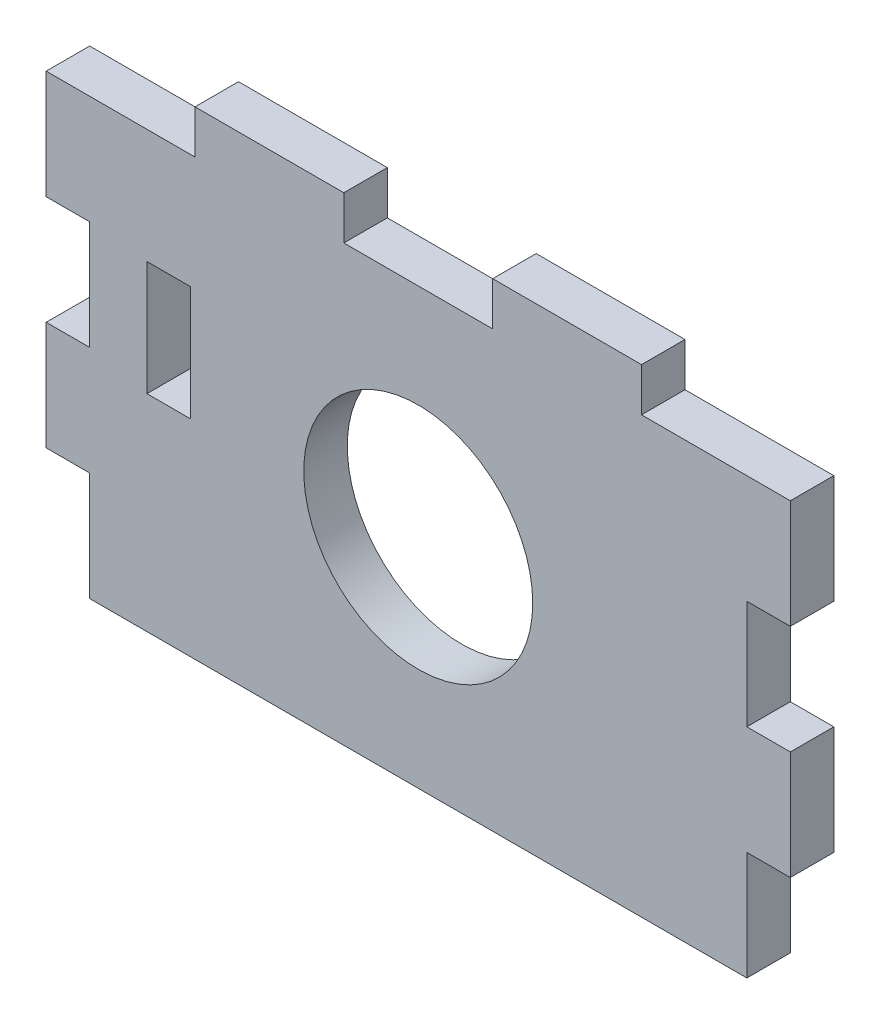
ISO-10303-21;
HEADER;
FILE_DESCRIPTION(('STEP AP214'),'2;1');
FILE_NAME('part.step','',(''),(''),'','','');
FILE_SCHEMA(('AUTOMOTIVE_DESIGN { 1 0 10303 214 1 1 1 1 }'));
ENDSEC;
DATA;
#1=APPLICATION_CONTEXT('core data for automotive mechanical design processes');
#2=APPLICATION_PROTOCOL_DEFINITION('international standard','automotive_design',2000,#1);
#3=PRODUCT_CONTEXT('',#1,'mechanical');
#4=PRODUCT('Part','Part','',(#3));
#5=PRODUCT_RELATED_PRODUCT_CATEGORY('part','',(#4));
#6=PRODUCT_DEFINITION_FORMATION('','',#4);
#7=PRODUCT_DEFINITION_CONTEXT('part definition',#1,'design');
#8=PRODUCT_DEFINITION('design','',#6,#7);
#9=PRODUCT_DEFINITION_SHAPE('','',#8);
#10=(LENGTH_UNIT() NAMED_UNIT(*) SI_UNIT(.MILLI.,.METRE.));
#11=(NAMED_UNIT(*) PLANE_ANGLE_UNIT() SI_UNIT($,.RADIAN.));
#12=(NAMED_UNIT(*) SI_UNIT($,.STERADIAN.) SOLID_ANGLE_UNIT());
#13=UNCERTAINTY_MEASURE_WITH_UNIT(LENGTH_MEASURE(1.E-05),#10,'distance_accuracy_value','');
#14=(GEOMETRIC_REPRESENTATION_CONTEXT(3) GLOBAL_UNCERTAINTY_ASSIGNED_CONTEXT((#13)) GLOBAL_UNIT_ASSIGNED_CONTEXT((#10,
#11,#12)) REPRESENTATION_CONTEXT('',''));
#15=CARTESIAN_POINT('',(0.,0.,0.));
#16=DIRECTION('',(0.,0.,1.));
#17=DIRECTION('',(1.,0.,0.));
#18=AXIS2_PLACEMENT_3D('',#15,#16,#17);
#19=CARTESIAN_POINT('',(-5.53524932452526,14.1108572179902,4.826));
#20=DIRECTION('',(-1.,0.,0.));
#21=DIRECTION('',(0.,0.,1.));
#22=AXIS2_PLACEMENT_3D('',#19,#20,#21);
#23=PLANE('',#22);
#24=DIRECTION('',(0.,1.,0.));
#25=VECTOR('',#24,1.);
#26=CARTESIAN_POINT('',(-5.53524932452526,14.1108572179902,4.826));
#27=LINE('',#26,#25);
#28=CARTESIAN_POINT('',(-5.53524932452527,-2.78014278200983,4.826));
#29=VERTEX_POINT('',#28);
#30=CARTESIAN_POINT('',(-5.53524932452526,9.28485721799016,4.826));
#31=VERTEX_POINT('',#30);
#32=EDGE_CURVE('E423',#29,#31,#27,.T.);
#33=ORIENTED_EDGE('',*,*,#32,.F.);
#34=DIRECTION('',(0.,0.,1.));
#35=VECTOR('',#34,1.);
#36=CARTESIAN_POINT('',(-5.53524932452527,-2.78014278200983,0.));
#37=LINE('',#36,#35);
#38=CARTESIAN_POINT('',(-5.53524932452527,-2.78014278200983,0.));
#39=VERTEX_POINT('',#38);
#40=EDGE_CURVE('E279',#39,#29,#37,.T.);
#41=ORIENTED_EDGE('',*,*,#40,.F.);
#42=DIRECTION('',(0.,1.,0.));
#43=VECTOR('',#42,1.);
#44=CARTESIAN_POINT('',(-5.53524932452526,14.1108572179902,0.));
#45=LINE('',#44,#43);
#46=CARTESIAN_POINT('',(-5.53524932452526,9.28485721799016,0.));
#47=VERTEX_POINT('',#46);
#48=EDGE_CURVE('E432',#39,#47,#45,.T.);
#49=ORIENTED_EDGE('',*,*,#48,.T.);
#50=DIRECTION('',(0.,0.,1.));
#51=VECTOR('',#50,1.);
#52=CARTESIAN_POINT('',(-5.53524932452526,9.28485721799016,0.));
#53=LINE('',#52,#51);
#54=EDGE_CURVE('E366',#47,#31,#53,.T.);
#55=ORIENTED_EDGE('',*,*,#54,.T.);
#56=EDGE_LOOP('',(#33,#41,#49,#55));
#57=FACE_BOUND('',#56,.T.);
#58=ADVANCED_FACE('F33',(#57),#23,.F.);
#59=CARTESIAN_POINT('',(-88.0852493245253,14.1108572179902,4.826));
#60=DIRECTION('',(1.,0.,0.));
#61=DIRECTION('',(0.,0.,-1.));
#62=AXIS2_PLACEMENT_3D('',#59,#60,#61);
#63=PLANE('',#62);
#64=DIRECTION('',(0.,-1.,0.));
#65=VECTOR('',#64,1.);
#66=CARTESIAN_POINT('',(-88.0852493245253,14.1108572179902,0.));
#67=LINE('',#66,#65);
#68=CARTESIAN_POINT('',(-88.0852493245253,9.28485721799016,0.));
#69=VERTEX_POINT('',#68);
#70=CARTESIAN_POINT('',(-88.0852493245253,-2.78014278200984,0.));
#71=VERTEX_POINT('',#70);
#72=EDGE_CURVE('E427',#69,#71,#67,.T.);
#73=ORIENTED_EDGE('',*,*,#72,.T.);
#74=DIRECTION('',(0.,0.,1.));
#75=VECTOR('',#74,1.);
#76=CARTESIAN_POINT('',(-88.0852493245253,-2.78014278200984,0.));
#77=LINE('',#76,#75);
#78=CARTESIAN_POINT('',(-88.0852493245253,-2.78014278200984,4.826));
#79=VERTEX_POINT('',#78);
#80=EDGE_CURVE('E323',#71,#79,#77,.T.);
#81=ORIENTED_EDGE('',*,*,#80,.T.);
#82=DIRECTION('',(0.,-1.,0.));
#83=VECTOR('',#82,1.);
#84=CARTESIAN_POINT('',(-88.0852493245253,14.1108572179902,4.826));
#85=LINE('',#84,#83);
#86=CARTESIAN_POINT('',(-88.0852493245253,9.28485721799016,4.826));
#87=VERTEX_POINT('',#86);
#88=EDGE_CURVE('E416',#87,#79,#85,.T.);
#89=ORIENTED_EDGE('',*,*,#88,.F.);
#90=DIRECTION('',(0.,0.,1.));
#91=VECTOR('',#90,1.);
#92=CARTESIAN_POINT('',(-88.0852493245253,9.28485721799016,0.));
#93=LINE('',#92,#91);
#94=EDGE_CURVE('E404',#69,#87,#93,.T.);
#95=ORIENTED_EDGE('',*,*,#94,.F.);
#96=EDGE_LOOP('',(#73,#81,#89,#95));
#97=FACE_BOUND('',#96,.T.);
#98=ADVANCED_FACE('F488',(#97),#63,.F.);
#99=CARTESIAN_POINT('',(-88.0852493245253,14.1108572179902,4.826));
#100=DIRECTION('',(0.,-1.,0.));
#101=DIRECTION('',(0.,0.,-1.));
#102=AXIS2_PLACEMENT_3D('',#99,#100,#101);
#103=PLANE('',#102);
#104=DIRECTION('',(-1.,0.,0.));
#105=VECTOR('',#104,1.);
#106=CARTESIAN_POINT('',(-88.0852493245253,14.1108572179902,4.826));
#107=LINE('',#106,#105);
#108=CARTESIAN_POINT('',(-55.0652493245253,14.1108572179902,4.826));
#109=VERTEX_POINT('',#108);
#110=CARTESIAN_POINT('',(-71.5752493245253,14.1108572179902,4.826));
#111=VERTEX_POINT('',#110);
#112=EDGE_CURVE('E42',#109,#111,#107,.T.);
#113=ORIENTED_EDGE('',*,*,#112,.F.);
#114=DIRECTION('',(0.,0.,1.));
#115=VECTOR('',#114,1.);
#116=CARTESIAN_POINT('',(-55.0652493245253,14.1108572179902,0.));
#117=LINE('',#116,#115);
#118=CARTESIAN_POINT('',(-55.0652493245253,14.1108572179902,0.));
#119=VERTEX_POINT('',#118);
#120=EDGE_CURVE('E388',#119,#109,#117,.T.);
#121=ORIENTED_EDGE('',*,*,#120,.F.);
#122=DIRECTION('',(-1.,0.,0.));
#123=VECTOR('',#122,1.);
#124=CARTESIAN_POINT('',(-88.0852493245253,14.1108572179902,0.));
#125=LINE('',#124,#123);
#126=CARTESIAN_POINT('',(-71.5752493245253,14.1108572179902,0.));
#127=VERTEX_POINT('',#126);
#128=EDGE_CURVE('E435',#119,#127,#125,.T.);
#129=ORIENTED_EDGE('',*,*,#128,.T.);
#130=DIRECTION('',(0.,0.,1.));
#131=VECTOR('',#130,1.);
#132=CARTESIAN_POINT('',(-71.5752493245253,14.1108572179902,0.));
#133=LINE('',#132,#131);
#134=EDGE_CURVE('E409',#127,#111,#133,.T.);
#135=ORIENTED_EDGE('',*,*,#134,.T.);
#136=EDGE_LOOP('',(#113,#121,#129,#135));
#137=FACE_BOUND('',#136,.T.);
#138=ADVANCED_FACE('F475',(#137),#103,.F.);
#139=CARTESIAN_POINT('',(-88.0852493245253,-14.8451427820098,4.826));
#140=VERTEX_POINT('',#139);
#141=CARTESIAN_POINT('',(-88.0852493245253,-26.9101427820098,4.826));
#142=VERTEX_POINT('',#141);
#143=EDGE_CURVE('E420',#140,#142,#85,.T.);
#144=ORIENTED_EDGE('',*,*,#143,.F.);
#145=DIRECTION('',(0.,0.,1.));
#146=VECTOR('',#145,1.);
#147=CARTESIAN_POINT('',(-88.0852493245253,-14.8451427820098,0.));
#148=LINE('',#147,#146);
#149=CARTESIAN_POINT('',(-88.0852493245253,-14.8451427820098,0.));
#150=VERTEX_POINT('',#149);
#151=EDGE_CURVE('E316',#150,#140,#148,.T.);
#152=ORIENTED_EDGE('',*,*,#151,.F.);
#153=CARTESIAN_POINT('',(-88.0852493245253,-26.9101427820098,0.));
#154=VERTEX_POINT('',#153);
#155=EDGE_CURVE('E412',#150,#154,#67,.T.);
#156=ORIENTED_EDGE('',*,*,#155,.T.);
#157=DIRECTION('',(0.,0.,1.));
#158=VECTOR('',#157,1.);
#159=CARTESIAN_POINT('',(-88.0852493245253,-26.9101427820098,0.));
#160=LINE('',#159,#158);
#161=EDGE_CURVE('E344',#154,#142,#160,.T.);
#162=ORIENTED_EDGE('',*,*,#161,.T.);
#163=EDGE_LOOP('',(#144,#152,#156,#162));
#164=FACE_BOUND('',#163,.T.);
#165=ADVANCED_FACE('F35',(#164),#63,.F.);
#166=CARTESIAN_POINT('',(-88.0852493245253,-38.9751427820098,4.826));
#167=DIRECTION('',(0.,1.,0.));
#168=DIRECTION('',(0.,0.,1.));
#169=AXIS2_PLACEMENT_3D('',#166,#167,#168);
#170=PLANE('',#169);
#171=DIRECTION('',(1.,0.,0.));
#172=VECTOR('',#171,1.);
#173=CARTESIAN_POINT('',(-88.0852493245253,-38.9751427820098,0.));
#174=LINE('',#173,#172);
#175=CARTESIAN_POINT('',(-83.2592493245252,-38.9751427820098,0.));
#176=VERTEX_POINT('',#175);
#177=CARTESIAN_POINT('',(-10.3612493245253,-38.9751427820098,0.));
#178=VERTEX_POINT('',#177);
#179=EDGE_CURVE('E430',#176,#178,#174,.T.);
#180=ORIENTED_EDGE('',*,*,#179,.T.);
#181=DIRECTION('',(0.,0.,1.));
#182=VECTOR('',#181,1.);
#183=CARTESIAN_POINT('',(-10.3612493245253,-38.9751427820098,0.));
#184=LINE('',#183,#182);
#185=CARTESIAN_POINT('',(-10.3612493245253,-38.9751427820098,4.826));
#186=VERTEX_POINT('',#185);
#187=EDGE_CURVE('E299',#178,#186,#184,.T.);
#188=ORIENTED_EDGE('',*,*,#187,.T.);
#189=DIRECTION('',(1.,0.,0.));
#190=VECTOR('',#189,1.);
#191=CARTESIAN_POINT('',(-88.0852493245253,-38.9751427820098,4.826));
#192=LINE('',#191,#190);
#193=CARTESIAN_POINT('',(-83.2592493245252,-38.9751427820098,4.826));
#194=VERTEX_POINT('',#193);
#195=EDGE_CURVE('E419',#194,#186,#192,.T.);
#196=ORIENTED_EDGE('',*,*,#195,.F.);
#197=DIRECTION('',(0.,0.,1.));
#198=VECTOR('',#197,1.);
#199=CARTESIAN_POINT('',(-83.2592493245252,-38.9751427820098,0.));
#200=LINE('',#199,#198);
#201=EDGE_CURVE('E339',#176,#194,#200,.T.);
#202=ORIENTED_EDGE('',*,*,#201,.F.);
#203=EDGE_LOOP('',(#180,#188,#196,#202));
#204=FACE_BOUND('',#203,.T.);
#205=ADVANCED_FACE('F516',(#204),#170,.F.);
#206=CARTESIAN_POINT('',(-5.53524932452526,-26.9101427820098,0.));
#207=VERTEX_POINT('',#206);
#208=CARTESIAN_POINT('',(-5.53524932452527,-14.8451427820098,0.));
#209=VERTEX_POINT('',#208);
#210=EDGE_CURVE('E433',#207,#209,#45,.T.);
#211=ORIENTED_EDGE('',*,*,#210,.T.);
#212=DIRECTION('',(0.,0.,1.));
#213=VECTOR('',#212,1.);
#214=CARTESIAN_POINT('',(-5.53524932452527,-14.8451427820098,0.));
#215=LINE('',#214,#213);
#216=CARTESIAN_POINT('',(-5.53524932452527,-14.8451427820098,4.826));
#217=VERTEX_POINT('',#216);
#218=EDGE_CURVE('E282',#209,#217,#215,.T.);
#219=ORIENTED_EDGE('',*,*,#218,.T.);
#220=CARTESIAN_POINT('',(-5.53524932452526,-26.9101427820098,4.826));
#221=VERTEX_POINT('',#220);
#222=EDGE_CURVE('E424',#221,#217,#27,.T.);
#223=ORIENTED_EDGE('',*,*,#222,.F.);
#224=DIRECTION('',(0.,0.,1.));
#225=VECTOR('',#224,1.);
#226=CARTESIAN_POINT('',(-5.53524932452526,-26.9101427820098,0.));
#227=LINE('',#226,#225);
#228=EDGE_CURVE('E295',#207,#221,#227,.T.);
#229=ORIENTED_EDGE('',*,*,#228,.F.);
#230=EDGE_LOOP('',(#211,#219,#223,#229));
#231=FACE_BOUND('',#230,.T.);
#232=ADVANCED_FACE('F525',(#231),#23,.F.);
#233=CARTESIAN_POINT('',(-22.0452493245253,14.1108572179902,4.826));
#234=VERTEX_POINT('',#233);
#235=CARTESIAN_POINT('',(-38.5552493245253,14.1108572179902,4.826));
#236=VERTEX_POINT('',#235);
#237=EDGE_CURVE('E11',#234,#236,#107,.T.);
#238=ORIENTED_EDGE('',*,*,#237,.F.);
#239=DIRECTION('',(0.,0.,1.));
#240=VECTOR('',#239,1.);
#241=CARTESIAN_POINT('',(-22.0452493245253,14.1108572179902,0.));
#242=LINE('',#241,#240);
#243=CARTESIAN_POINT('',(-22.0452493245253,14.1108572179902,0.));
#244=VERTEX_POINT('',#243);
#245=EDGE_CURVE('E363',#244,#234,#242,.T.);
#246=ORIENTED_EDGE('',*,*,#245,.F.);
#247=CARTESIAN_POINT('',(-38.5552493245253,14.1108572179902,0.));
#248=VERTEX_POINT('',#247);
#249=EDGE_CURVE('E37',#244,#248,#125,.T.);
#250=ORIENTED_EDGE('',*,*,#249,.T.);
#251=DIRECTION('',(0.,0.,1.));
#252=VECTOR('',#251,1.);
#253=CARTESIAN_POINT('',(-38.5552493245253,14.1108572179902,0.));
#254=LINE('',#253,#252);
#255=EDGE_CURVE('E391',#248,#236,#254,.T.);
#256=ORIENTED_EDGE('',*,*,#255,.T.);
#257=EDGE_LOOP('',(#238,#246,#250,#256));
#258=FACE_BOUND('',#257,.T.);
#259=ADVANCED_FACE('F456',(#258),#103,.F.);
#260=CARTESIAN_POINT('',(0.,0.,4.826));
#261=DIRECTION('',(0.,0.,1.));
#262=DIRECTION('',(1.,0.,0.));
#263=AXIS2_PLACEMENT_3D('',#260,#261,#262);
#264=PLANE('',#263);
#265=DIRECTION('',(0.,1.,0.));
#266=VECTOR('',#265,1.);
#267=CARTESIAN_POINT('',(-72.0832493245252,-16.1151427820099,4.826));
#268=LINE('',#267,#266);
#269=CARTESIAN_POINT('',(-72.0832493245252,-16.1151427820099,4.826));
#270=VERTEX_POINT('',#269);
#271=CARTESIAN_POINT('',(-72.0832493245252,-3.4151427820099,4.826));
#272=VERTEX_POINT('',#271);
#273=EDGE_CURVE('E50',#270,#272,#268,.T.);
#274=ORIENTED_EDGE('',*,*,#273,.F.);
#275=DIRECTION('',(1.,0.,0.));
#276=VECTOR('',#275,1.);
#277=CARTESIAN_POINT('',(-72.0832493245252,-16.1151427820099,4.826));
#278=LINE('',#277,#276);
#279=CARTESIAN_POINT('',(-76.9092493245252,-16.1151427820099,4.826));
#280=VERTEX_POINT('',#279);
#281=EDGE_CURVE('E237',#280,#270,#278,.T.);
#282=ORIENTED_EDGE('',*,*,#281,.F.);
#283=DIRECTION('',(0.,-1.,0.));
#284=VECTOR('',#283,1.);
#285=CARTESIAN_POINT('',(-76.9092493245252,-16.1151427820099,4.826));
#286=LINE('',#285,#284);
#287=CARTESIAN_POINT('',(-76.9092493245252,-3.4151427820099,4.826));
#288=VERTEX_POINT('',#287);
#289=EDGE_CURVE('E240',#288,#280,#286,.T.);
#290=ORIENTED_EDGE('',*,*,#289,.F.);
#291=DIRECTION('',(-1.,0.,0.));
#292=VECTOR('',#291,1.);
#293=CARTESIAN_POINT('',(-72.0832493245252,-3.4151427820099,4.826));
#294=LINE('',#293,#292);
#295=EDGE_CURVE('E246',#272,#288,#294,.T.);
#296=ORIENTED_EDGE('',*,*,#295,.F.);
#297=EDGE_LOOP('',(#274,#282,#290,#296));
#298=FACE_BOUND('',#297,.T.);
#299=CARTESIAN_POINT('',(-46.8102493245253,-14.8451427820098,4.826));
#300=DIRECTION('',(0.,0.,1.));
#301=DIRECTION('',(1.,0.,0.));
#302=AXIS2_PLACEMENT_3D('',#299,#300,#301);
#303=CIRCLE('',#302,12.7);
#304=CARTESIAN_POINT('',(-34.1102493245253,-14.8451427820098,4.826));
#305=VERTEX_POINT('',#304);
#306=EDGE_CURVE('E252',#305,#305,#303,.T.);
#307=ORIENTED_EDGE('',*,*,#306,.F.);
#308=EDGE_LOOP('',(#307));
#309=FACE_BOUND('',#308,.T.);
#310=DIRECTION('',(-1.,0.,0.));
#311=VECTOR('',#310,1.);
#312=CARTESIAN_POINT('',(-5.53524932452527,-2.78014278200983,4.826));
#313=LINE('',#312,#311);
#314=CARTESIAN_POINT('',(-10.3612493245253,-2.78014278200983,4.826));
#315=VERTEX_POINT('',#314);
#316=EDGE_CURVE('E259',#29,#315,#313,.T.);
#317=ORIENTED_EDGE('',*,*,#316,.F.);
#318=ORIENTED_EDGE('',*,*,#32,.T.);
#319=DIRECTION('',(1.,0.,0.));
#320=VECTOR('',#319,1.);
#321=CARTESIAN_POINT('',(-22.0452493245253,9.28485721799016,4.826));
#322=LINE('',#321,#320);
#323=CARTESIAN_POINT('',(-22.0452493245253,9.28485721799016,4.826));
#324=VERTEX_POINT('',#323);
#325=EDGE_CURVE('E355',#324,#31,#322,.T.);
#326=ORIENTED_EDGE('',*,*,#325,.F.);
#327=DIRECTION('',(0.,-1.,0.));
#328=VECTOR('',#327,1.);
#329=CARTESIAN_POINT('',(-22.0452493245253,14.1108572179902,4.826));
#330=LINE('',#329,#328);
#331=EDGE_CURVE('E347',#234,#324,#330,.T.);
#332=ORIENTED_EDGE('',*,*,#331,.F.);
#333=ORIENTED_EDGE('',*,*,#237,.T.);
#334=DIRECTION('',(0.,1.,0.));
#335=VECTOR('',#334,1.);
#336=CARTESIAN_POINT('',(-38.5552493245253,14.1108572179902,4.826));
#337=LINE('',#336,#335);
#338=CARTESIAN_POINT('',(-38.5552493245253,9.28485721799016,4.826));
#339=VERTEX_POINT('',#338);
#340=EDGE_CURVE('E374',#339,#236,#337,.T.);
#341=ORIENTED_EDGE('',*,*,#340,.F.);
#342=DIRECTION('',(1.,0.,0.));
#343=VECTOR('',#342,1.);
#344=CARTESIAN_POINT('',(-55.0652493245253,9.28485721799016,4.826));
#345=LINE('',#344,#343);
#346=CARTESIAN_POINT('',(-55.0652493245253,9.28485721799016,4.826));
#347=VERTEX_POINT('',#346);
#348=EDGE_CURVE('E383',#347,#339,#345,.T.);
#349=ORIENTED_EDGE('',*,*,#348,.F.);
#350=DIRECTION('',(0.,-1.,0.));
#351=VECTOR('',#350,1.);
#352=CARTESIAN_POINT('',(-55.0652493245253,14.1108572179902,4.826));
#353=LINE('',#352,#351);
#354=EDGE_CURVE('E365',#109,#347,#353,.T.);
#355=ORIENTED_EDGE('',*,*,#354,.F.);
#356=ORIENTED_EDGE('',*,*,#112,.T.);
#357=DIRECTION('',(0.,1.,0.));
#358=VECTOR('',#357,1.);
#359=CARTESIAN_POINT('',(-71.5752493245253,14.1108572179902,4.826));
#360=LINE('',#359,#358);
#361=CARTESIAN_POINT('',(-71.5752493245253,9.28485721799016,4.826));
#362=VERTEX_POINT('',#361);
#363=EDGE_CURVE('E401',#362,#111,#360,.T.);
#364=ORIENTED_EDGE('',*,*,#363,.F.);
#365=DIRECTION('',(1.,0.,0.));
#366=VECTOR('',#365,1.);
#367=CARTESIAN_POINT('',(-88.0852493245253,9.28485721799016,4.826));
#368=LINE('',#367,#366);
#369=EDGE_CURVE('E390',#87,#362,#368,.T.);
#370=ORIENTED_EDGE('',*,*,#369,.F.);
#371=ORIENTED_EDGE('',*,*,#88,.T.);
#372=DIRECTION('',(-1.,0.,0.));
#373=VECTOR('',#372,1.);
#374=CARTESIAN_POINT('',(-88.0852493245253,-2.78014278200984,4.826));
#375=LINE('',#374,#373);
#376=CARTESIAN_POINT('',(-83.2592493245253,-2.78014278200984,4.826));
#377=VERTEX_POINT('',#376);
#378=EDGE_CURVE('E310',#377,#79,#375,.T.);
#379=ORIENTED_EDGE('',*,*,#378,.F.);
#380=DIRECTION('',(0.,1.,0.));
#381=VECTOR('',#380,1.);
#382=CARTESIAN_POINT('',(-83.2592493245253,-2.78014278200984,4.826));
#383=LINE('',#382,#381);
#384=CARTESIAN_POINT('',(-83.2592493245253,-14.8451427820098,4.826));
#385=VERTEX_POINT('',#384);
#386=EDGE_CURVE('E319',#385,#377,#383,.T.);
#387=ORIENTED_EDGE('',*,*,#386,.F.);
#388=DIRECTION('',(1.,0.,0.));
#389=VECTOR('',#388,1.);
#390=CARTESIAN_POINT('',(-88.0852493245253,-14.8451427820098,4.826));
#391=LINE('',#390,#389);
#392=EDGE_CURVE('E302',#140,#385,#391,.T.);
#393=ORIENTED_EDGE('',*,*,#392,.F.);
#394=ORIENTED_EDGE('',*,*,#143,.T.);
#395=DIRECTION('',(-1.,0.,0.));
#396=VECTOR('',#395,1.);
#397=CARTESIAN_POINT('',(-88.0852493245253,-26.9101427820098,4.826));
#398=LINE('',#397,#396);
#399=CARTESIAN_POINT('',(-83.2592493245253,-26.9101427820098,4.826));
#400=VERTEX_POINT('',#399);
#401=EDGE_CURVE('E336',#400,#142,#398,.T.);
#402=ORIENTED_EDGE('',*,*,#401,.F.);
#403=DIRECTION('',(0.,1.,0.));
#404=VECTOR('',#403,1.);
#405=CARTESIAN_POINT('',(-83.2592493245252,-38.9751427820098,4.826));
#406=LINE('',#405,#404);
#407=EDGE_CURVE('E326',#194,#400,#406,.T.);
#408=ORIENTED_EDGE('',*,*,#407,.F.);
#409=ORIENTED_EDGE('',*,*,#195,.T.);
#410=DIRECTION('',(0.,-1.,0.));
#411=VECTOR('',#410,1.);
#412=CARTESIAN_POINT('',(-10.3612493245253,-38.9751427820098,4.826));
#413=LINE('',#412,#411);
#414=CARTESIAN_POINT('',(-10.3612493245253,-26.9101427820098,4.826));
#415=VERTEX_POINT('',#414);
#416=EDGE_CURVE('E292',#415,#186,#413,.T.);
#417=ORIENTED_EDGE('',*,*,#416,.F.);
#418=DIRECTION('',(-1.,0.,0.));
#419=VECTOR('',#418,1.);
#420=CARTESIAN_POINT('',(-5.53524932452526,-26.9101427820098,4.826));
#421=LINE('',#420,#419);
#422=EDGE_CURVE('E281',#221,#415,#421,.T.);
#423=ORIENTED_EDGE('',*,*,#422,.F.);
#424=ORIENTED_EDGE('',*,*,#222,.T.);
#425=DIRECTION('',(1.,0.,0.));
#426=VECTOR('',#425,1.);
#427=CARTESIAN_POINT('',(-5.53524932452527,-14.8451427820098,4.826));
#428=LINE('',#427,#426);
#429=CARTESIAN_POINT('',(-10.3612493245253,-14.8451427820098,4.826));
#430=VERTEX_POINT('',#429);
#431=EDGE_CURVE('E266',#430,#217,#428,.T.);
#432=ORIENTED_EDGE('',*,*,#431,.F.);
#433=DIRECTION('',(0.,-1.,0.));
#434=VECTOR('',#433,1.);
#435=CARTESIAN_POINT('',(-10.3612493245253,-2.78014278200983,4.826));
#436=LINE('',#435,#434);
#437=EDGE_CURVE('E275',#315,#430,#436,.T.);
#438=ORIENTED_EDGE('',*,*,#437,.F.);
#439=EDGE_LOOP('',(#317,#318,#326,#332,#333,#341,#349,#355,#356,#364,#370,#371,#379,#387,#393,
#394,#402,#408,#409,#417,#423,#424,#432,#438));
#440=FACE_BOUND('',#439,.T.);
#441=ADVANCED_FACE('F461',(#298,#309,#440),#264,.T.);
#442=CARTESIAN_POINT('',(0.,0.,0.));
#443=DIRECTION('',(0.,0.,1.));
#444=DIRECTION('',(1.,0.,0.));
#445=AXIS2_PLACEMENT_3D('',#442,#443,#444);
#446=PLANE('',#445);
#447=DIRECTION('',(1.,0.,0.));
#448=VECTOR('',#447,1.);
#449=CARTESIAN_POINT('',(-72.0832493245252,-16.1151427820099,0.));
#450=LINE('',#449,#448);
#451=CARTESIAN_POINT('',(-76.9092493245252,-16.1151427820099,0.));
#452=VERTEX_POINT('',#451);
#453=CARTESIAN_POINT('',(-72.0832493245252,-16.1151427820099,0.));
#454=VERTEX_POINT('',#453);
#455=EDGE_CURVE('E227',#452,#454,#450,.T.);
#456=ORIENTED_EDGE('',*,*,#455,.T.);
#457=DIRECTION('',(0.,1.,0.));
#458=VECTOR('',#457,1.);
#459=CARTESIAN_POINT('',(-72.0832493245252,-16.1151427820099,0.));
#460=LINE('',#459,#458);
#461=CARTESIAN_POINT('',(-72.0832493245252,-3.4151427820099,0.));
#462=VERTEX_POINT('',#461);
#463=EDGE_CURVE('E221',#454,#462,#460,.T.);
#464=ORIENTED_EDGE('',*,*,#463,.T.);
#465=DIRECTION('',(-1.,0.,0.));
#466=VECTOR('',#465,1.);
#467=CARTESIAN_POINT('',(-72.0832493245252,-3.4151427820099,0.));
#468=LINE('',#467,#466);
#469=CARTESIAN_POINT('',(-76.9092493245252,-3.4151427820099,0.));
#470=VERTEX_POINT('',#469);
#471=EDGE_CURVE('E230',#462,#470,#468,.T.);
#472=ORIENTED_EDGE('',*,*,#471,.T.);
#473=DIRECTION('',(0.,-1.,0.));
#474=VECTOR('',#473,1.);
#475=CARTESIAN_POINT('',(-76.9092493245252,-16.1151427820099,0.));
#476=LINE('',#475,#474);
#477=EDGE_CURVE('E58',#470,#452,#476,.T.);
#478=ORIENTED_EDGE('',*,*,#477,.T.);
#479=EDGE_LOOP('',(#456,#464,#472,#478));
#480=FACE_BOUND('',#479,.T.);
#481=CARTESIAN_POINT('',(-46.8102493245253,-14.8451427820098,0.));
#482=DIRECTION('',(0.,0.,1.));
#483=DIRECTION('',(1.,0.,0.));
#484=AXIS2_PLACEMENT_3D('',#481,#482,#483);
#485=CIRCLE('',#484,12.7);
#486=CARTESIAN_POINT('',(-34.1102493245253,-14.8451427820098,0.));
#487=VERTEX_POINT('',#486);
#488=EDGE_CURVE('E256',#487,#487,#485,.T.);
#489=ORIENTED_EDGE('',*,*,#488,.T.);
#490=EDGE_LOOP('',(#489));
#491=FACE_BOUND('',#490,.T.);
#492=ORIENTED_EDGE('',*,*,#48,.F.);
#493=DIRECTION('',(-1.,0.,0.));
#494=VECTOR('',#493,1.);
#495=CARTESIAN_POINT('',(-5.53524932452527,-2.78014278200983,0.));
#496=LINE('',#495,#494);
#497=CARTESIAN_POINT('',(-10.3612493245253,-2.78014278200983,0.));
#498=VERTEX_POINT('',#497);
#499=EDGE_CURVE('E262',#39,#498,#496,.T.);
#500=ORIENTED_EDGE('',*,*,#499,.T.);
#501=DIRECTION('',(0.,-1.,0.));
#502=VECTOR('',#501,1.);
#503=CARTESIAN_POINT('',(-10.3612493245253,-2.78014278200983,0.));
#504=LINE('',#503,#502);
#505=CARTESIAN_POINT('',(-10.3612493245253,-14.8451427820098,0.));
#506=VERTEX_POINT('',#505);
#507=EDGE_CURVE('E265',#498,#506,#504,.T.);
#508=ORIENTED_EDGE('',*,*,#507,.T.);
#509=DIRECTION('',(1.,0.,0.));
#510=VECTOR('',#509,1.);
#511=CARTESIAN_POINT('',(-5.53524932452527,-14.8451427820098,0.));
#512=LINE('',#511,#510);
#513=EDGE_CURVE('E269',#506,#209,#512,.T.);
#514=ORIENTED_EDGE('',*,*,#513,.T.);
#515=ORIENTED_EDGE('',*,*,#210,.F.);
#516=DIRECTION('',(-1.,0.,0.));
#517=VECTOR('',#516,1.);
#518=CARTESIAN_POINT('',(-5.53524932452526,-26.9101427820098,0.));
#519=LINE('',#518,#517);
#520=CARTESIAN_POINT('',(-10.3612493245253,-26.9101427820098,0.));
#521=VERTEX_POINT('',#520);
#522=EDGE_CURVE('E288',#207,#521,#519,.T.);
#523=ORIENTED_EDGE('',*,*,#522,.T.);
#524=DIRECTION('',(0.,-1.,0.));
#525=VECTOR('',#524,1.);
#526=CARTESIAN_POINT('',(-10.3612493245253,-38.9751427820098,0.));
#527=LINE('',#526,#525);
#528=EDGE_CURVE('E291',#521,#178,#527,.T.);
#529=ORIENTED_EDGE('',*,*,#528,.T.);
#530=ORIENTED_EDGE('',*,*,#179,.F.);
#531=DIRECTION('',(0.,1.,0.));
#532=VECTOR('',#531,1.);
#533=CARTESIAN_POINT('',(-83.2592493245252,-38.9751427820098,0.));
#534=LINE('',#533,#532);
#535=CARTESIAN_POINT('',(-83.2592493245253,-26.9101427820098,0.));
#536=VERTEX_POINT('',#535);
#537=EDGE_CURVE('E332',#176,#536,#534,.T.);
#538=ORIENTED_EDGE('',*,*,#537,.T.);
#539=DIRECTION('',(-1.,0.,0.));
#540=VECTOR('',#539,1.);
#541=CARTESIAN_POINT('',(-88.0852493245253,-26.9101427820098,0.));
#542=LINE('',#541,#540);
#543=EDGE_CURVE('E335',#536,#154,#542,.T.);
#544=ORIENTED_EDGE('',*,*,#543,.T.);
#545=ORIENTED_EDGE('',*,*,#155,.F.);
#546=DIRECTION('',(1.,0.,0.));
#547=VECTOR('',#546,1.);
#548=CARTESIAN_POINT('',(-88.0852493245253,-14.8451427820098,0.));
#549=LINE('',#548,#547);
#550=CARTESIAN_POINT('',(-83.2592493245253,-14.8451427820098,0.));
#551=VERTEX_POINT('',#550);
#552=EDGE_CURVE('E306',#150,#551,#549,.T.);
#553=ORIENTED_EDGE('',*,*,#552,.T.);
#554=DIRECTION('',(0.,1.,0.));
#555=VECTOR('',#554,1.);
#556=CARTESIAN_POINT('',(-83.2592493245253,-2.78014278200984,0.));
#557=LINE('',#556,#555);
#558=CARTESIAN_POINT('',(-83.2592493245253,-2.78014278200984,0.));
#559=VERTEX_POINT('',#558);
#560=EDGE_CURVE('E309',#551,#559,#557,.T.);
#561=ORIENTED_EDGE('',*,*,#560,.T.);
#562=DIRECTION('',(-1.,0.,0.));
#563=VECTOR('',#562,1.);
#564=CARTESIAN_POINT('',(-88.0852493245253,-2.78014278200984,0.));
#565=LINE('',#564,#563);
#566=EDGE_CURVE('E313',#559,#71,#565,.T.);
#567=ORIENTED_EDGE('',*,*,#566,.T.);
#568=ORIENTED_EDGE('',*,*,#72,.F.);
#569=DIRECTION('',(1.,0.,0.));
#570=VECTOR('',#569,1.);
#571=CARTESIAN_POINT('',(-88.0852493245253,9.28485721799016,0.));
#572=LINE('',#571,#570);
#573=CARTESIAN_POINT('',(-71.5752493245253,9.28485721799016,0.));
#574=VERTEX_POINT('',#573);
#575=EDGE_CURVE('E397',#69,#574,#572,.T.);
#576=ORIENTED_EDGE('',*,*,#575,.T.);
#577=DIRECTION('',(0.,1.,0.));
#578=VECTOR('',#577,1.);
#579=CARTESIAN_POINT('',(-71.5752493245253,14.1108572179902,0.));
#580=LINE('',#579,#578);
#581=EDGE_CURVE('E400',#574,#127,#580,.T.);
#582=ORIENTED_EDGE('',*,*,#581,.T.);
#583=ORIENTED_EDGE('',*,*,#128,.F.);
#584=DIRECTION('',(0.,-1.,0.));
#585=VECTOR('',#584,1.);
#586=CARTESIAN_POINT('',(-55.0652493245253,14.1108572179902,0.));
#587=LINE('',#586,#585);
#588=CARTESIAN_POINT('',(-55.0652493245253,9.28485721799016,0.));
#589=VERTEX_POINT('',#588);
#590=EDGE_CURVE('E370',#119,#589,#587,.T.);
#591=ORIENTED_EDGE('',*,*,#590,.T.);
#592=DIRECTION('',(1.,0.,0.));
#593=VECTOR('',#592,1.);
#594=CARTESIAN_POINT('',(-55.0652493245253,9.28485721799016,0.));
#595=LINE('',#594,#593);
#596=CARTESIAN_POINT('',(-38.5552493245253,9.28485721799016,0.));
#597=VERTEX_POINT('',#596);
#598=EDGE_CURVE('E373',#589,#597,#595,.T.);
#599=ORIENTED_EDGE('',*,*,#598,.T.);
#600=DIRECTION('',(0.,1.,0.));
#601=VECTOR('',#600,1.);
#602=CARTESIAN_POINT('',(-38.5552493245253,14.1108572179902,0.));
#603=LINE('',#602,#601);
#604=EDGE_CURVE('E377',#597,#248,#603,.T.);
#605=ORIENTED_EDGE('',*,*,#604,.T.);
#606=ORIENTED_EDGE('',*,*,#249,.F.);
#607=DIRECTION('',(0.,-1.,0.));
#608=VECTOR('',#607,1.);
#609=CARTESIAN_POINT('',(-22.0452493245253,14.1108572179902,0.));
#610=LINE('',#609,#608);
#611=CARTESIAN_POINT('',(-22.0452493245253,9.28485721799016,0.));
#612=VERTEX_POINT('',#611);
#613=EDGE_CURVE('E351',#244,#612,#610,.T.);
#614=ORIENTED_EDGE('',*,*,#613,.T.);
#615=DIRECTION('',(1.,0.,0.));
#616=VECTOR('',#615,1.);
#617=CARTESIAN_POINT('',(-22.0452493245253,9.28485721799016,0.));
#618=LINE('',#617,#616);
#619=EDGE_CURVE('E354',#612,#47,#618,.T.);
#620=ORIENTED_EDGE('',*,*,#619,.T.);
#621=EDGE_LOOP('',(#492,#500,#508,#514,#515,#523,#529,#530,#538,#544,#545,#553,#561,#567,#568,
#576,#582,#583,#591,#599,#605,#606,#614,#620));
#622=FACE_BOUND('',#621,.T.);
#623=ADVANCED_FACE('F234',(#480,#491,#622),#446,.F.);
#624=CARTESIAN_POINT('',(-71.5752493245253,14.1108572179902,0.));
#625=DIRECTION('',(1.,0.,0.));
#626=DIRECTION('',(0.,0.,-1.));
#627=AXIS2_PLACEMENT_3D('',#624,#625,#626);
#628=PLANE('',#627);
#629=ORIENTED_EDGE('',*,*,#363,.T.);
#630=ORIENTED_EDGE('',*,*,#134,.F.);
#631=ORIENTED_EDGE('',*,*,#581,.F.);
#632=DIRECTION('',(0.,0.,1.));
#633=VECTOR('',#632,1.);
#634=CARTESIAN_POINT('',(-71.5752493245253,9.28485721799016,0.));
#635=LINE('',#634,#633);
#636=EDGE_CURVE('E413',#574,#362,#635,.T.);
#637=ORIENTED_EDGE('',*,*,#636,.T.);
#638=EDGE_LOOP('',(#629,#630,#631,#637));
#639=FACE_BOUND('',#638,.T.);
#640=ADVANCED_FACE('F479',(#639),#628,.F.);
#641=CARTESIAN_POINT('',(-88.0852493245253,9.28485721799016,0.));
#642=DIRECTION('',(0.,-1.,0.));
#643=DIRECTION('',(0.,0.,-1.));
#644=AXIS2_PLACEMENT_3D('',#641,#642,#643);
#645=PLANE('',#644);
#646=ORIENTED_EDGE('',*,*,#369,.T.);
#647=ORIENTED_EDGE('',*,*,#636,.F.);
#648=ORIENTED_EDGE('',*,*,#575,.F.);
#649=ORIENTED_EDGE('',*,*,#94,.T.);
#650=EDGE_LOOP('',(#646,#647,#648,#649));
#651=FACE_BOUND('',#650,.T.);
#652=ADVANCED_FACE('F484',(#651),#645,.F.);
#653=CARTESIAN_POINT('',(-55.0652493245253,14.1108572179902,0.));
#654=DIRECTION('',(-1.,0.,0.));
#655=DIRECTION('',(0.,0.,1.));
#656=AXIS2_PLACEMENT_3D('',#653,#654,#655);
#657=PLANE('',#656);
#658=ORIENTED_EDGE('',*,*,#354,.T.);
#659=DIRECTION('',(0.,0.,1.));
#660=VECTOR('',#659,1.);
#661=CARTESIAN_POINT('',(-55.0652493245253,9.28485721799016,0.));
#662=LINE('',#661,#660);
#663=EDGE_CURVE('E380',#589,#347,#662,.T.);
#664=ORIENTED_EDGE('',*,*,#663,.F.);
#665=ORIENTED_EDGE('',*,*,#590,.F.);
#666=ORIENTED_EDGE('',*,*,#120,.T.);
#667=EDGE_LOOP('',(#658,#664,#665,#666));
#668=FACE_BOUND('',#667,.T.);
#669=ADVANCED_FACE('F573',(#668),#657,.F.);
#670=CARTESIAN_POINT('',(-38.5552493245253,14.1108572179902,0.));
#671=DIRECTION('',(1.,0.,0.));
#672=DIRECTION('',(0.,0.,-1.));
#673=AXIS2_PLACEMENT_3D('',#670,#671,#672);
#674=PLANE('',#673);
#675=ORIENTED_EDGE('',*,*,#340,.T.);
#676=ORIENTED_EDGE('',*,*,#255,.F.);
#677=ORIENTED_EDGE('',*,*,#604,.F.);
#678=DIRECTION('',(0.,0.,1.));
#679=VECTOR('',#678,1.);
#680=CARTESIAN_POINT('',(-38.5552493245253,9.28485721799016,0.));
#681=LINE('',#680,#679);
#682=EDGE_CURVE('E394',#597,#339,#681,.T.);
#683=ORIENTED_EDGE('',*,*,#682,.T.);
#684=EDGE_LOOP('',(#675,#676,#677,#683));
#685=FACE_BOUND('',#684,.T.);
#686=ADVANCED_FACE('F464',(#685),#674,.F.);
#687=CARTESIAN_POINT('',(-55.0652493245253,9.28485721799016,0.));
#688=DIRECTION('',(0.,-1.,0.));
#689=DIRECTION('',(0.,0.,-1.));
#690=AXIS2_PLACEMENT_3D('',#687,#688,#689);
#691=PLANE('',#690);
#692=ORIENTED_EDGE('',*,*,#348,.T.);
#693=ORIENTED_EDGE('',*,*,#682,.F.);
#694=ORIENTED_EDGE('',*,*,#598,.F.);
#695=ORIENTED_EDGE('',*,*,#663,.T.);
#696=EDGE_LOOP('',(#692,#693,#694,#695));
#697=FACE_BOUND('',#696,.T.);
#698=ADVANCED_FACE('F468',(#697),#691,.F.);
#699=CARTESIAN_POINT('',(-22.0452493245253,14.1108572179902,0.));
#700=DIRECTION('',(-1.,0.,0.));
#701=DIRECTION('',(0.,0.,1.));
#702=AXIS2_PLACEMENT_3D('',#699,#700,#701);
#703=PLANE('',#702);
#704=ORIENTED_EDGE('',*,*,#331,.T.);
#705=DIRECTION('',(0.,0.,1.));
#706=VECTOR('',#705,1.);
#707=CARTESIAN_POINT('',(-22.0452493245253,9.28485721799016,0.));
#708=LINE('',#707,#706);
#709=EDGE_CURVE('E358',#612,#324,#708,.T.);
#710=ORIENTED_EDGE('',*,*,#709,.F.);
#711=ORIENTED_EDGE('',*,*,#613,.F.);
#712=ORIENTED_EDGE('',*,*,#245,.T.);
#713=EDGE_LOOP('',(#704,#710,#711,#712));
#714=FACE_BOUND('',#713,.T.);
#715=ADVANCED_FACE('F452',(#714),#703,.F.);
#716=CARTESIAN_POINT('',(-22.0452493245253,9.28485721799016,0.));
#717=DIRECTION('',(0.,-1.,0.));
#718=DIRECTION('',(0.,0.,-1.));
#719=AXIS2_PLACEMENT_3D('',#716,#717,#718);
#720=PLANE('',#719);
#721=ORIENTED_EDGE('',*,*,#325,.T.);
#722=ORIENTED_EDGE('',*,*,#54,.F.);
#723=ORIENTED_EDGE('',*,*,#619,.F.);
#724=ORIENTED_EDGE('',*,*,#709,.T.);
#725=EDGE_LOOP('',(#721,#722,#723,#724));
#726=FACE_BOUND('',#725,.T.);
#727=ADVANCED_FACE('F447',(#726),#720,.F.);
#728=CARTESIAN_POINT('',(-88.0852493245253,-26.9101427820098,0.));
#729=DIRECTION('',(0.,1.,0.));
#730=DIRECTION('',(0.,0.,1.));
#731=AXIS2_PLACEMENT_3D('',#728,#729,#730);
#732=PLANE('',#731);
#733=ORIENTED_EDGE('',*,*,#401,.T.);
#734=ORIENTED_EDGE('',*,*,#161,.F.);
#735=ORIENTED_EDGE('',*,*,#543,.F.);
#736=DIRECTION('',(0.,0.,1.));
#737=VECTOR('',#736,1.);
#738=CARTESIAN_POINT('',(-83.2592493245253,-26.9101427820098,0.));
#739=LINE('',#738,#737);
#740=EDGE_CURVE('E348',#536,#400,#739,.T.);
#741=ORIENTED_EDGE('',*,*,#740,.T.);
#742=EDGE_LOOP('',(#733,#734,#735,#741));
#743=FACE_BOUND('',#742,.T.);
#744=ADVANCED_FACE('F507',(#743),#732,.F.);
#745=CARTESIAN_POINT('',(-83.2592493245252,-38.9751427820098,0.));
#746=DIRECTION('',(1.,0.,0.));
#747=DIRECTION('',(0.,1.,0.));
#748=AXIS2_PLACEMENT_3D('',#745,#746,#747);
#749=PLANE('',#748);
#750=ORIENTED_EDGE('',*,*,#407,.T.);
#751=ORIENTED_EDGE('',*,*,#740,.F.);
#752=ORIENTED_EDGE('',*,*,#537,.F.);
#753=ORIENTED_EDGE('',*,*,#201,.T.);
#754=EDGE_LOOP('',(#750,#751,#752,#753));
#755=FACE_BOUND('',#754,.T.);
#756=ADVANCED_FACE('F512',(#755),#749,.F.);
#757=CARTESIAN_POINT('',(-88.0852493245253,-2.78014278200984,0.));
#758=DIRECTION('',(0.,1.,0.));
#759=DIRECTION('',(0.,0.,1.));
#760=AXIS2_PLACEMENT_3D('',#757,#758,#759);
#761=PLANE('',#760);
#762=ORIENTED_EDGE('',*,*,#378,.T.);
#763=ORIENTED_EDGE('',*,*,#80,.F.);
#764=ORIENTED_EDGE('',*,*,#566,.F.);
#765=DIRECTION('',(0.,0.,1.));
#766=VECTOR('',#765,1.);
#767=CARTESIAN_POINT('',(-83.2592493245253,-2.78014278200984,0.));
#768=LINE('',#767,#766);
#769=EDGE_CURVE('E327',#559,#377,#768,.T.);
#770=ORIENTED_EDGE('',*,*,#769,.T.);
#771=EDGE_LOOP('',(#762,#763,#764,#770));
#772=FACE_BOUND('',#771,.T.);
#773=ADVANCED_FACE('F493',(#772),#761,.F.);
#774=CARTESIAN_POINT('',(-83.2592493245253,-2.78014278200984,0.));
#775=DIRECTION('',(1.,0.,0.));
#776=DIRECTION('',(0.,0.,-1.));
#777=AXIS2_PLACEMENT_3D('',#774,#775,#776);
#778=PLANE('',#777);
#779=ORIENTED_EDGE('',*,*,#386,.T.);
#780=ORIENTED_EDGE('',*,*,#769,.F.);
#781=ORIENTED_EDGE('',*,*,#560,.F.);
#782=DIRECTION('',(0.,0.,1.));
#783=VECTOR('',#782,1.);
#784=CARTESIAN_POINT('',(-83.2592493245253,-14.8451427820098,0.));
#785=LINE('',#784,#783);
#786=EDGE_CURVE('E329',#551,#385,#785,.T.);
#787=ORIENTED_EDGE('',*,*,#786,.T.);
#788=EDGE_LOOP('',(#779,#780,#781,#787));
#789=FACE_BOUND('',#788,.T.);
#790=ADVANCED_FACE('F496',(#789),#778,.F.);
#791=CARTESIAN_POINT('',(-88.0852493245253,-14.8451427820098,0.));
#792=DIRECTION('',(0.,-1.,0.));
#793=DIRECTION('',(0.,0.,-1.));
#794=AXIS2_PLACEMENT_3D('',#791,#792,#793);
#795=PLANE('',#794);
#796=ORIENTED_EDGE('',*,*,#392,.T.);
#797=ORIENTED_EDGE('',*,*,#786,.F.);
#798=ORIENTED_EDGE('',*,*,#552,.F.);
#799=ORIENTED_EDGE('',*,*,#151,.T.);
#800=EDGE_LOOP('',(#796,#797,#798,#799));
#801=FACE_BOUND('',#800,.T.);
#802=ADVANCED_FACE('F499',(#801),#795,.F.);
#803=CARTESIAN_POINT('',(-10.3612493245253,-38.9751427820098,0.));
#804=DIRECTION('',(-1.,0.,0.));
#805=DIRECTION('',(0.,-1.,0.));
#806=AXIS2_PLACEMENT_3D('',#803,#804,#805);
#807=PLANE('',#806);
#808=ORIENTED_EDGE('',*,*,#416,.T.);
#809=ORIENTED_EDGE('',*,*,#187,.F.);
#810=ORIENTED_EDGE('',*,*,#528,.F.);
#811=DIRECTION('',(0.,0.,1.));
#812=VECTOR('',#811,1.);
#813=CARTESIAN_POINT('',(-10.3612493245253,-26.9101427820098,0.));
#814=LINE('',#813,#812);
#815=EDGE_CURVE('E303',#521,#415,#814,.T.);
#816=ORIENTED_EDGE('',*,*,#815,.T.);
#817=EDGE_LOOP('',(#808,#809,#810,#816));
#818=FACE_BOUND('',#817,.T.);
#819=ADVANCED_FACE('F521',(#818),#807,.F.);
#820=CARTESIAN_POINT('',(-5.53524932452526,-26.9101427820098,0.));
#821=DIRECTION('',(0.,1.,0.));
#822=DIRECTION('',(0.,0.,1.));
#823=AXIS2_PLACEMENT_3D('',#820,#821,#822);
#824=PLANE('',#823);
#825=ORIENTED_EDGE('',*,*,#422,.T.);
#826=ORIENTED_EDGE('',*,*,#815,.F.);
#827=ORIENTED_EDGE('',*,*,#522,.F.);
#828=ORIENTED_EDGE('',*,*,#228,.T.);
#829=EDGE_LOOP('',(#825,#826,#827,#828));
#830=FACE_BOUND('',#829,.T.);
#831=ADVANCED_FACE('F524',(#830),#824,.F.);
#832=CARTESIAN_POINT('',(-5.53524932452527,-2.78014278200983,0.));
#833=DIRECTION('',(0.,1.,0.));
#834=DIRECTION('',(-1.,0.,0.));
#835=AXIS2_PLACEMENT_3D('',#832,#833,#834);
#836=PLANE('',#835);
#837=ORIENTED_EDGE('',*,*,#316,.T.);
#838=DIRECTION('',(0.,0.,1.));
#839=VECTOR('',#838,1.);
#840=CARTESIAN_POINT('',(-10.3612493245253,-2.78014278200983,0.));
#841=LINE('',#840,#839);
#842=EDGE_CURVE('E272',#498,#315,#841,.T.);
#843=ORIENTED_EDGE('',*,*,#842,.F.);
#844=ORIENTED_EDGE('',*,*,#499,.F.);
#845=ORIENTED_EDGE('',*,*,#40,.T.);
#846=EDGE_LOOP('',(#837,#843,#844,#845));
#847=FACE_BOUND('',#846,.T.);
#848=ADVANCED_FACE('F535',(#847),#836,.F.);
#849=CARTESIAN_POINT('',(-5.53524932452527,-14.8451427820098,0.));
#850=DIRECTION('',(0.,-1.,0.));
#851=DIRECTION('',(1.,0.,0.));
#852=AXIS2_PLACEMENT_3D('',#849,#850,#851);
#853=PLANE('',#852);
#854=ORIENTED_EDGE('',*,*,#431,.T.);
#855=ORIENTED_EDGE('',*,*,#218,.F.);
#856=ORIENTED_EDGE('',*,*,#513,.F.);
#857=DIRECTION('',(0.,0.,1.));
#858=VECTOR('',#857,1.);
#859=CARTESIAN_POINT('',(-10.3612493245253,-14.8451427820098,0.));
#860=LINE('',#859,#858);
#861=EDGE_CURVE('E285',#506,#430,#860,.T.);
#862=ORIENTED_EDGE('',*,*,#861,.T.);
#863=EDGE_LOOP('',(#854,#855,#856,#862));
#864=FACE_BOUND('',#863,.T.);
#865=ADVANCED_FACE('F529',(#864),#853,.F.);
#866=CARTESIAN_POINT('',(-10.3612493245253,-2.78014278200983,0.));
#867=DIRECTION('',(-1.,0.,0.));
#868=DIRECTION('',(0.,0.,1.));
#869=AXIS2_PLACEMENT_3D('',#866,#867,#868);
#870=PLANE('',#869);
#871=ORIENTED_EDGE('',*,*,#437,.T.);
#872=ORIENTED_EDGE('',*,*,#861,.F.);
#873=ORIENTED_EDGE('',*,*,#507,.F.);
#874=ORIENTED_EDGE('',*,*,#842,.T.);
#875=EDGE_LOOP('',(#871,#872,#873,#874));
#876=FACE_BOUND('',#875,.T.);
#877=ADVANCED_FACE('F531',(#876),#870,.F.);
#878=CARTESIAN_POINT('',(-46.8102493245253,-14.8451427820098,0.));
#879=DIRECTION('',(0.,0.,1.));
#880=DIRECTION('',(1.,0.,0.));
#881=AXIS2_PLACEMENT_3D('',#878,#879,#880);
#882=CYLINDRICAL_SURFACE('',#881,12.7);
#883=ORIENTED_EDGE('',*,*,#488,.F.);
#884=EDGE_LOOP('',(#883));
#885=FACE_BOUND('',#884,.T.);
#886=ORIENTED_EDGE('',*,*,#306,.T.);
#887=EDGE_LOOP('',(#886));
#888=FACE_BOUND('',#887,.T.);
#889=ADVANCED_FACE('F623',(#885,#888),#882,.F.);
#890=CARTESIAN_POINT('',(-72.0832493245252,-16.1151427820099,0.));
#891=DIRECTION('',(1.,0.,0.));
#892=DIRECTION('',(0.,0.,-1.));
#893=AXIS2_PLACEMENT_3D('',#890,#891,#892);
#894=PLANE('',#893);
#895=ORIENTED_EDGE('',*,*,#273,.T.);
#896=DIRECTION('',(0.,0.,1.));
#897=VECTOR('',#896,1.);
#898=CARTESIAN_POINT('',(-72.0832493245252,-3.4151427820099,0.));
#899=LINE('',#898,#897);
#900=EDGE_CURVE('E217',#462,#272,#899,.T.);
#901=ORIENTED_EDGE('',*,*,#900,.F.);
#902=ORIENTED_EDGE('',*,*,#463,.F.);
#903=DIRECTION('',(0.,0.,1.));
#904=VECTOR('',#903,1.);
#905=CARTESIAN_POINT('',(-72.0832493245252,-16.1151427820099,0.));
#906=LINE('',#905,#904);
#907=EDGE_CURVE('E250',#454,#270,#906,.T.);
#908=ORIENTED_EDGE('',*,*,#907,.T.);
#909=EDGE_LOOP('',(#895,#901,#902,#908));
#910=FACE_BOUND('',#909,.T.);
#911=ADVANCED_FACE('F219',(#910),#894,.F.);
#912=CARTESIAN_POINT('',(-72.0832493245252,-16.1151427820099,0.));
#913=DIRECTION('',(0.,-1.,0.));
#914=DIRECTION('',(0.,0.,-1.));
#915=AXIS2_PLACEMENT_3D('',#912,#913,#914);
#916=PLANE('',#915);
#917=ORIENTED_EDGE('',*,*,#281,.T.);
#918=ORIENTED_EDGE('',*,*,#907,.F.);
#919=ORIENTED_EDGE('',*,*,#455,.F.);
#920=DIRECTION('',(0.,0.,1.));
#921=VECTOR('',#920,1.);
#922=CARTESIAN_POINT('',(-76.9092493245252,-16.1151427820099,0.));
#923=LINE('',#922,#921);
#924=EDGE_CURVE('E253',#452,#280,#923,.T.);
#925=ORIENTED_EDGE('',*,*,#924,.T.);
#926=EDGE_LOOP('',(#917,#918,#919,#925));
#927=FACE_BOUND('',#926,.T.);
#928=ADVANCED_FACE('F654',(#927),#916,.F.);
#929=CARTESIAN_POINT('',(-76.9092493245252,-16.1151427820099,0.));
#930=DIRECTION('',(-1.,0.,0.));
#931=DIRECTION('',(0.,0.,1.));
#932=AXIS2_PLACEMENT_3D('',#929,#930,#931);
#933=PLANE('',#932);
#934=ORIENTED_EDGE('',*,*,#289,.T.);
#935=ORIENTED_EDGE('',*,*,#924,.F.);
#936=ORIENTED_EDGE('',*,*,#477,.F.);
#937=DIRECTION('',(0.,0.,1.));
#938=VECTOR('',#937,1.);
#939=CARTESIAN_POINT('',(-76.9092493245252,-3.4151427820099,0.));
#940=LINE('',#939,#938);
#941=EDGE_CURVE('E226',#470,#288,#940,.T.);
#942=ORIENTED_EDGE('',*,*,#941,.T.);
#943=EDGE_LOOP('',(#934,#935,#936,#942));
#944=FACE_BOUND('',#943,.T.);
#945=ADVANCED_FACE('F663',(#944),#933,.F.);
#946=CARTESIAN_POINT('',(-72.0832493245252,-3.4151427820099,0.));
#947=DIRECTION('',(0.,1.,0.));
#948=DIRECTION('',(-1.,0.,0.));
#949=AXIS2_PLACEMENT_3D('',#946,#947,#948);
#950=PLANE('',#949);
#951=ORIENTED_EDGE('',*,*,#295,.T.);
#952=ORIENTED_EDGE('',*,*,#941,.F.);
#953=ORIENTED_EDGE('',*,*,#471,.F.);
#954=ORIENTED_EDGE('',*,*,#900,.T.);
#955=EDGE_LOOP('',(#951,#952,#953,#954));
#956=FACE_BOUND('',#955,.T.);
#957=ADVANCED_FACE('F231',(#956),#950,.F.);
#958=CLOSED_SHELL('',(#58,#98,#138,#165,#205,#232,#259,#441,#623,#640,#652,#669,#686,#698,#715,
#727,#744,#756,#773,#790,#802,#819,#831,#848,#865,#877,#889,#911,#928,#945,#957));
#959=MANIFOLD_SOLID_BREP('B2',#958);
#960=ADVANCED_BREP_SHAPE_REPRESENTATION('',(#18,#959),#14);
#961=SHAPE_DEFINITION_REPRESENTATION(#9,#960);
ENDSEC;
END-ISO-10303-21;
